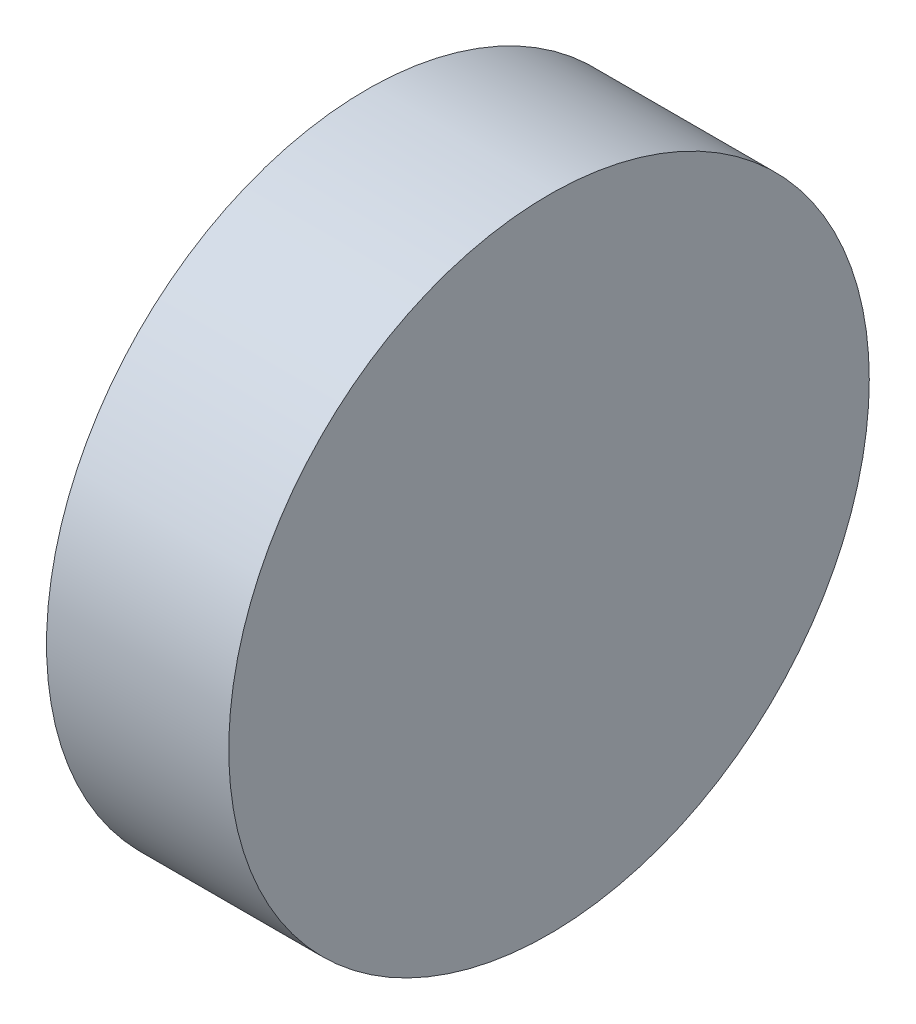
ISO-10303-21;
HEADER;
FILE_DESCRIPTION(('STEP AP214'),'2;1');
FILE_NAME('part.step','',(''),(''),'','','');
FILE_SCHEMA(('AUTOMOTIVE_DESIGN { 1 0 10303 214 1 1 1 1 }'));
ENDSEC;
DATA;
#1=APPLICATION_CONTEXT('core data for automotive mechanical design processes');
#2=APPLICATION_PROTOCOL_DEFINITION('international standard','automotive_design',2000,#1);
#3=PRODUCT_CONTEXT('',#1,'mechanical');
#4=PRODUCT('Part','Part','',(#3));
#5=PRODUCT_RELATED_PRODUCT_CATEGORY('part','',(#4));
#6=PRODUCT_DEFINITION_FORMATION('','',#4);
#7=PRODUCT_DEFINITION_CONTEXT('part definition',#1,'design');
#8=PRODUCT_DEFINITION('design','',#6,#7);
#9=PRODUCT_DEFINITION_SHAPE('','',#8);
#10=(LENGTH_UNIT() NAMED_UNIT(*) SI_UNIT(.MILLI.,.METRE.));
#11=(NAMED_UNIT(*) PLANE_ANGLE_UNIT() SI_UNIT($,.RADIAN.));
#12=(NAMED_UNIT(*) SI_UNIT($,.STERADIAN.) SOLID_ANGLE_UNIT());
#13=UNCERTAINTY_MEASURE_WITH_UNIT(LENGTH_MEASURE(1.E-05),#10,'distance_accuracy_value','');
#14=(GEOMETRIC_REPRESENTATION_CONTEXT(3) GLOBAL_UNCERTAINTY_ASSIGNED_CONTEXT((#13)) GLOBAL_UNIT_ASSIGNED_CONTEXT((#10,
#11,#12)) REPRESENTATION_CONTEXT('',''));
#15=CARTESIAN_POINT('',(0.,0.,0.));
#16=DIRECTION('',(0.,0.,1.));
#17=DIRECTION('',(1.,0.,0.));
#18=AXIS2_PLACEMENT_3D('',#15,#16,#17);
#19=CARTESIAN_POINT('',(-27.,0.,0.));
#20=DIRECTION('',(1.,0.,0.));
#21=DIRECTION('',(0.,0.,-1.));
#22=AXIS2_PLACEMENT_3D('',#19,#20,#21);
#23=CYLINDRICAL_SURFACE('',#22,14.5);
#24=CARTESIAN_POINT('',(-27.,0.,0.));
#25=DIRECTION('',(1.,0.,0.));
#26=DIRECTION('',(0.,0.,-1.));
#27=AXIS2_PLACEMENT_3D('',#24,#25,#26);
#28=CIRCLE('',#27,14.5);
#29=CARTESIAN_POINT('',(-27.,0.,-14.5));
#30=VERTEX_POINT('',#29);
#31=EDGE_CURVE('E10',#30,#30,#28,.T.);
#32=ORIENTED_EDGE('',*,*,#31,.T.);
#33=EDGE_LOOP('',(#32));
#34=FACE_BOUND('',#33,.T.);
#35=CARTESIAN_POINT('',(-18.75,0.,0.));
#36=DIRECTION('',(1.,0.,0.));
#37=DIRECTION('',(0.,0.,-1.));
#38=AXIS2_PLACEMENT_3D('',#35,#36,#37);
#39=CIRCLE('',#38,14.5);
#40=CARTESIAN_POINT('',(-18.75,0.,-14.5));
#41=VERTEX_POINT('',#40);
#42=EDGE_CURVE('E40',#41,#41,#39,.T.);
#43=ORIENTED_EDGE('',*,*,#42,.F.);
#44=EDGE_LOOP('',(#43));
#45=FACE_BOUND('',#44,.T.);
#46=ADVANCED_FACE('F37',(#34,#45),#23,.T.);
#47=CARTESIAN_POINT('',(-27.,0.,0.));
#48=DIRECTION('',(1.,0.,0.));
#49=DIRECTION('',(0.,0.,-1.));
#50=AXIS2_PLACEMENT_3D('',#47,#48,#49);
#51=PLANE('',#50);
#52=ORIENTED_EDGE('',*,*,#31,.F.);
#53=EDGE_LOOP('',(#52));
#54=FACE_BOUND('',#53,.T.);
#55=ADVANCED_FACE('F52',(#54),#51,.F.);
#56=CARTESIAN_POINT('',(-18.75,0.,0.));
#57=DIRECTION('',(1.,0.,0.));
#58=DIRECTION('',(0.,0.,-1.));
#59=AXIS2_PLACEMENT_3D('',#56,#57,#58);
#60=PLANE('',#59);
#61=ORIENTED_EDGE('',*,*,#42,.T.);
#62=EDGE_LOOP('',(#61));
#63=FACE_BOUND('',#62,.T.);
#64=ADVANCED_FACE('F49',(#63),#60,.T.);
#65=CLOSED_SHELL('',(#46,#55,#64));
#66=MANIFOLD_SOLID_BREP('B2',#65);
#67=ADVANCED_BREP_SHAPE_REPRESENTATION('',(#18,#66),#14);
#68=SHAPE_DEFINITION_REPRESENTATION(#9,#67);
ENDSEC;
END-ISO-10303-21;
